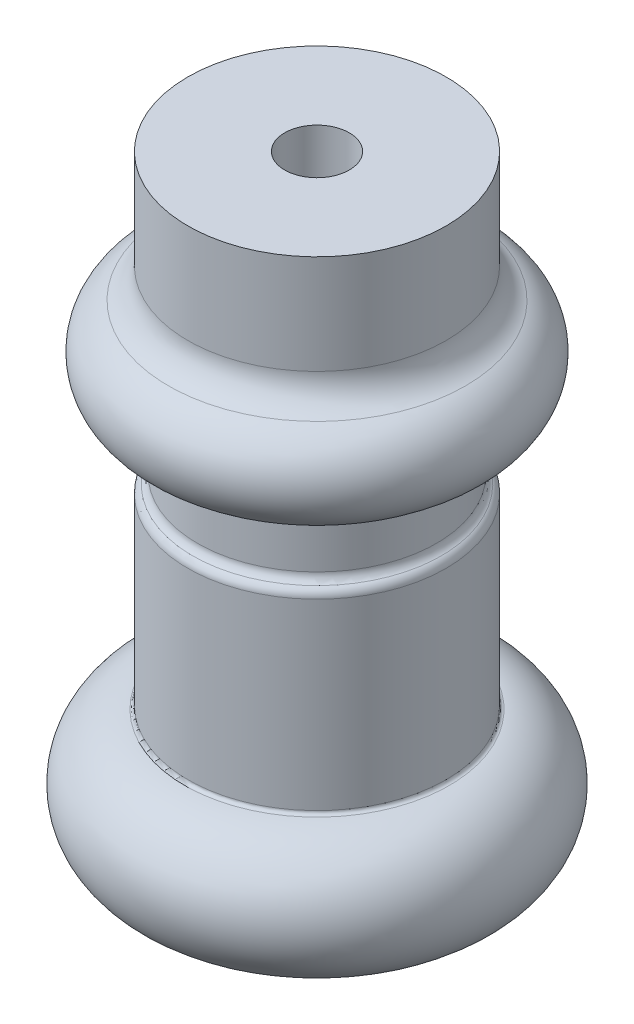
ISO-10303-21;
HEADER;
FILE_DESCRIPTION(('STEP AP214'),'2;1');
FILE_NAME('part.step','',(''),(''),'','','');
FILE_SCHEMA(('AUTOMOTIVE_DESIGN { 1 0 10303 214 1 1 1 1 }'));
ENDSEC;
DATA;
#1=APPLICATION_CONTEXT('core data for automotive mechanical design processes');
#2=APPLICATION_PROTOCOL_DEFINITION('international standard','automotive_design',2000,#1);
#3=PRODUCT_CONTEXT('',#1,'mechanical');
#4=PRODUCT('Part','Part','',(#3));
#5=PRODUCT_RELATED_PRODUCT_CATEGORY('part','',(#4));
#6=PRODUCT_DEFINITION_FORMATION('','',#4);
#7=PRODUCT_DEFINITION_CONTEXT('part definition',#1,'design');
#8=PRODUCT_DEFINITION('design','',#6,#7);
#9=PRODUCT_DEFINITION_SHAPE('','',#8);
#10=(LENGTH_UNIT() NAMED_UNIT(*) SI_UNIT(.MILLI.,.METRE.));
#11=(NAMED_UNIT(*) PLANE_ANGLE_UNIT() SI_UNIT($,.RADIAN.));
#12=(NAMED_UNIT(*) SI_UNIT($,.STERADIAN.) SOLID_ANGLE_UNIT());
#13=UNCERTAINTY_MEASURE_WITH_UNIT(LENGTH_MEASURE(1.E-05),#10,'distance_accuracy_value','');
#14=(GEOMETRIC_REPRESENTATION_CONTEXT(3) GLOBAL_UNCERTAINTY_ASSIGNED_CONTEXT((#13)) GLOBAL_UNIT_ASSIGNED_CONTEXT((#10,
#11,#12)) REPRESENTATION_CONTEXT('',''));
#15=CARTESIAN_POINT('',(0.,0.,0.));
#16=DIRECTION('',(0.,0.,1.));
#17=DIRECTION('',(1.,0.,0.));
#18=AXIS2_PLACEMENT_3D('',#15,#16,#17);
#19=CARTESIAN_POINT('',(-12.047292046932,66.4662497286088,0.));
#20=DIRECTION('',(0.,1.,0.));
#21=DIRECTION('',(-1.,0.,0.));
#22=AXIS2_PLACEMENT_3D('',#19,#20,#21);
#23=TOROIDAL_SURFACE('',#22,50.,10.);
#24=CARTESIAN_POINT('',(-12.047292046932,66.4662497286088,0.));
#25=DIRECTION('',(0.,1.,0.));
#26=DIRECTION('',(-1.,0.,0.));
#27=AXIS2_PLACEMENT_3D('',#24,#25,#26);
#28=CIRCLE('',#27,40.);
#29=CARTESIAN_POINT('',(-52.047292046932,66.4662497286088,0.));
#30=VERTEX_POINT('',#29);
#31=EDGE_CURVE('E10',#30,#30,#28,.T.);
#32=ORIENTED_EDGE('',*,*,#31,.F.);
#33=EDGE_LOOP('',(#32));
#34=FACE_BOUND('',#33,.T.);
#35=CARTESIAN_POINT('',(-12.047292046932,57.3010983386971,0.));
#36=DIRECTION('',(0.,1.,0.));
#37=DIRECTION('',(-1.,0.,0.));
#38=AXIS2_PLACEMENT_3D('',#35,#36,#37);
#39=CIRCLE('',#38,46.);
#40=CARTESIAN_POINT('',(-58.047292046932,57.3010983386971,0.));
#41=VERTEX_POINT('',#40);
#42=EDGE_CURVE('E95',#41,#41,#39,.T.);
#43=ORIENTED_EDGE('',*,*,#42,.T.);
#44=EDGE_LOOP('',(#43));
#45=FACE_BOUND('',#44,.T.);
#46=ADVANCED_FACE('F40',(#34,#45),#23,.F.);
#47=CARTESIAN_POINT('',(-12.047292046932,-59.0452330936272,0.));
#48=DIRECTION('',(0.,1.,0.));
#49=DIRECTION('',(-1.,0.,0.));
#50=AXIS2_PLACEMENT_3D('',#47,#48,#49);
#51=CYLINDRICAL_SURFACE('',#50,40.);
#52=CARTESIAN_POINT('',(-12.047292046932,97.211500143964,0.));
#53=DIRECTION('',(0.,1.,0.));
#54=DIRECTION('',(-1.,0.,0.));
#55=AXIS2_PLACEMENT_3D('',#52,#53,#54);
#56=CIRCLE('',#55,40.);
#57=CARTESIAN_POINT('',(-52.047292046932,97.211500143964,0.));
#58=VERTEX_POINT('',#57);
#59=EDGE_CURVE('E47',#58,#58,#56,.T.);
#60=ORIENTED_EDGE('',*,*,#59,.F.);
#61=EDGE_LOOP('',(#60));
#62=FACE_BOUND('',#61,.T.);
#63=ORIENTED_EDGE('',*,*,#31,.T.);
#64=EDGE_LOOP('',(#63));
#65=FACE_BOUND('',#64,.T.);
#66=ADVANCED_FACE('F160',(#62,#65),#51,.T.);
#67=CARTESIAN_POINT('',(-2.04729204693199,97.211500143964,0.));
#68=DIRECTION('',(0.,-1.,0.));
#69=DIRECTION('',(1.,0.,0.));
#70=AXIS2_PLACEMENT_3D('',#67,#68,#69);
#71=PLANE('',#70);
#72=CARTESIAN_POINT('',(-12.047292046932,97.211500143964,0.));
#73=DIRECTION('',(0.,1.,0.));
#74=DIRECTION('',(-1.,0.,0.));
#75=AXIS2_PLACEMENT_3D('',#72,#73,#74);
#76=CIRCLE('',#75,9.99999999999999);
#77=CARTESIAN_POINT('',(-22.047292046932,97.211500143964,0.));
#78=VERTEX_POINT('',#77);
#79=EDGE_CURVE('E52',#78,#78,#76,.T.);
#80=ORIENTED_EDGE('',*,*,#79,.F.);
#81=EDGE_LOOP('',(#80));
#82=FACE_BOUND('',#81,.T.);
#83=ORIENTED_EDGE('',*,*,#59,.T.);
#84=EDGE_LOOP('',(#83));
#85=FACE_BOUND('',#84,.T.);
#86=ADVANCED_FACE('F165',(#82,#85),#71,.F.);
#87=CARTESIAN_POINT('',(-12.047292046932,-59.0452330936272,0.));
#88=DIRECTION('',(0.,1.,0.));
#89=DIRECTION('',(-1.,0.,0.));
#90=AXIS2_PLACEMENT_3D('',#87,#88,#89);
#91=CYLINDRICAL_SURFACE('',#90,9.99999999999999);
#92=CARTESIAN_POINT('',(-12.047292046932,34.3439740420331,0.));
#93=DIRECTION('',(0.,1.,0.));
#94=DIRECTION('',(-1.,0.,0.));
#95=AXIS2_PLACEMENT_3D('',#92,#93,#94);
#96=CIRCLE('',#95,9.99999999999999);
#97=CARTESIAN_POINT('',(-22.047292046932,34.3439740420331,0.));
#98=VERTEX_POINT('',#97);
#99=EDGE_CURVE('E57',#98,#98,#96,.T.);
#100=ORIENTED_EDGE('',*,*,#99,.F.);
#101=EDGE_LOOP('',(#100));
#102=FACE_BOUND('',#101,.T.);
#103=ORIENTED_EDGE('',*,*,#79,.T.);
#104=EDGE_LOOP('',(#103));
#105=FACE_BOUND('',#104,.T.);
#106=ADVANCED_FACE('F156',(#102,#105),#91,.F.);
#107=CARTESIAN_POINT('',(-12.047292046932,34.3439740420331,0.));
#108=DIRECTION('',(0.,-1.,0.));
#109=DIRECTION('',(1.,0.,0.));
#110=AXIS2_PLACEMENT_3D('',#107,#108,#109);
#111=PLANE('',#110);
#112=ORIENTED_EDGE('',*,*,#99,.T.);
#113=EDGE_LOOP('',(#112));
#114=FACE_BOUND('',#113,.T.);
#115=ADVANCED_FACE('F151',(#114),#111,.F.);
#116=CARTESIAN_POINT('',(-12.047292046932,-90.6560259579669,0.));
#117=DIRECTION('',(0.,1.,0.));
#118=DIRECTION('',(-1.,0.,0.));
#119=AXIS2_PLACEMENT_3D('',#116,#117,#118);
#120=PLANE('',#119);
#121=CARTESIAN_POINT('',(-12.047292046932,-90.6560259579669,0.));
#122=DIRECTION('',(0.,1.,0.));
#123=DIRECTION('',(-1.,0.,0.));
#124=AXIS2_PLACEMENT_3D('',#121,#122,#123);
#125=CIRCLE('',#124,47.1876513233572);
#126=CARTESIAN_POINT('',(-59.2349433702891,-90.6560259579669,0.));
#127=VERTEX_POINT('',#126);
#128=EDGE_CURVE('E63',#127,#127,#125,.T.);
#129=ORIENTED_EDGE('',*,*,#128,.F.);
#130=EDGE_LOOP('',(#129));
#131=FACE_BOUND('',#130,.T.);
#132=ADVANCED_FACE('F146',(#131),#120,.F.);
#133=CARTESIAN_POINT('',(-12.047292046932,-72.3253084026108,0.));
#134=DIRECTION('',(0.,1.,0.));
#135=DIRECTION('',(-1.,0.,0.));
#136=AXIS2_PLACEMENT_3D('',#133,#134,#135);
#137=TOROIDAL_SURFACE('',#136,39.1886017607054,20.);
#138=CARTESIAN_POINT('',(-12.047292046932,-52.4053806017237,0.));
#139=DIRECTION('',(0.,1.,0.));
#140=DIRECTION('',(-1.,0.,0.));
#141=AXIS2_PLACEMENT_3D('',#138,#139,#140);
#142=CIRCLE('',#141,40.9764709973792);
#143=CARTESIAN_POINT('',(-53.0237630443112,-52.4053806017237,0.));
#144=VERTEX_POINT('',#143);
#145=EDGE_CURVE('E67',#144,#144,#142,.T.);
#146=ORIENTED_EDGE('',*,*,#145,.F.);
#147=EDGE_LOOP('',(#146));
#148=FACE_BOUND('',#147,.T.);
#149=ORIENTED_EDGE('',*,*,#128,.T.);
#150=EDGE_LOOP('',(#149));
#151=FACE_BOUND('',#150,.T.);
#152=ADVANCED_FACE('F140',(#148,#151),#137,.T.);
#153=CARTESIAN_POINT('',(-12.047292046932,-51.3373434774447,0.));
#154=DIRECTION('',(0.,1.,0.));
#155=DIRECTION('',(-1.,0.,0.));
#156=AXIS2_PLACEMENT_3D('',#153,#154,#155);
#157=TOROIDAL_SURFACE('',#156,41.0723303166102,1.07233031661027);
#158=CARTESIAN_POINT('',(-12.047292046932,-51.3373434774447,0.));
#159=DIRECTION('',(0.,1.,0.));
#160=DIRECTION('',(-1.,0.,0.));
#161=AXIS2_PLACEMENT_3D('',#158,#159,#160);
#162=CIRCLE('',#161,40.);
#163=CARTESIAN_POINT('',(-52.0472920469319,-51.3373434774447,0.));
#164=VERTEX_POINT('',#163);
#165=EDGE_CURVE('E71',#164,#164,#162,.T.);
#166=ORIENTED_EDGE('',*,*,#165,.F.);
#167=EDGE_LOOP('',(#166));
#168=FACE_BOUND('',#167,.T.);
#169=ORIENTED_EDGE('',*,*,#145,.T.);
#170=EDGE_LOOP('',(#169));
#171=FACE_BOUND('',#170,.T.);
#172=ADVANCED_FACE('F134',(#168,#171),#157,.F.);
#173=CARTESIAN_POINT('',(-12.047292046932,-59.0452330936272,0.));
#174=DIRECTION('',(0.,1.,0.));
#175=DIRECTION('',(-1.,0.,0.));
#176=AXIS2_PLACEMENT_3D('',#173,#174,#175);
#177=CYLINDRICAL_SURFACE('',#176,40.);
#178=CARTESIAN_POINT('',(-12.047292046932,5.35721883112297,0.));
#179=DIRECTION('',(0.,1.,0.));
#180=DIRECTION('',(-1.,0.,0.));
#181=AXIS2_PLACEMENT_3D('',#178,#179,#180);
#182=CIRCLE('',#181,40.);
#183=CARTESIAN_POINT('',(-52.047292046932,5.35721883112296,0.));
#184=VERTEX_POINT('',#183);
#185=EDGE_CURVE('E75',#184,#184,#182,.T.);
#186=ORIENTED_EDGE('',*,*,#185,.F.);
#187=EDGE_LOOP('',(#186));
#188=FACE_BOUND('',#187,.T.);
#189=ORIENTED_EDGE('',*,*,#165,.T.);
#190=EDGE_LOOP('',(#189));
#191=FACE_BOUND('',#190,.T.);
#192=ADVANCED_FACE('F128',(#188,#191),#177,.T.);
#193=CARTESIAN_POINT('',(-12.047292046932,5.35721883112297,0.));
#194=DIRECTION('',(0.,1.,0.));
#195=DIRECTION('',(-1.,0.,0.));
#196=AXIS2_PLACEMENT_3D('',#193,#194,#195);
#197=TOROIDAL_SURFACE('',#196,37.,3.);
#198=CARTESIAN_POINT('',(-12.047292046932,7.95529504247628,0.));
#199=DIRECTION('',(0.,1.,0.));
#200=DIRECTION('',(-1.,0.,0.));
#201=AXIS2_PLACEMENT_3D('',#198,#199,#200);
#202=CIRCLE('',#201,38.5);
#203=CARTESIAN_POINT('',(-50.547292046932,7.95529504247628,0.));
#204=VERTEX_POINT('',#203);
#205=EDGE_CURVE('E79',#204,#204,#202,.T.);
#206=ORIENTED_EDGE('',*,*,#205,.F.);
#207=EDGE_LOOP('',(#206));
#208=FACE_BOUND('',#207,.T.);
#209=ORIENTED_EDGE('',*,*,#185,.T.);
#210=EDGE_LOOP('',(#209));
#211=FACE_BOUND('',#210,.T.);
#212=ADVANCED_FACE('F122',(#208,#211),#197,.T.);
#213=CARTESIAN_POINT('',(-12.047292046932,10.5533712538296,0.));
#214=DIRECTION('',(0.,1.,0.));
#215=DIRECTION('',(-1.,0.,0.));
#216=AXIS2_PLACEMENT_3D('',#213,#214,#215);
#217=TOROIDAL_SURFACE('',#216,40.,3.);
#218=CARTESIAN_POINT('',(-12.047292046932,10.5533712538296,0.));
#219=DIRECTION('',(0.,1.,0.));
#220=DIRECTION('',(-1.,0.,0.));
#221=AXIS2_PLACEMENT_3D('',#218,#219,#220);
#222=CIRCLE('',#221,37.);
#223=CARTESIAN_POINT('',(-49.047292046932,10.5533712538296,0.));
#224=VERTEX_POINT('',#223);
#225=EDGE_CURVE('E83',#224,#224,#222,.T.);
#226=ORIENTED_EDGE('',*,*,#225,.F.);
#227=EDGE_LOOP('',(#226));
#228=FACE_BOUND('',#227,.T.);
#229=ORIENTED_EDGE('',*,*,#205,.T.);
#230=EDGE_LOOP('',(#229));
#231=FACE_BOUND('',#230,.T.);
#232=ADVANCED_FACE('F116',(#228,#231),#217,.F.);
#233=CARTESIAN_POINT('',(-12.047292046932,-59.0452330936272,0.));
#234=DIRECTION('',(0.,1.,0.));
#235=DIRECTION('',(-1.,0.,0.));
#236=AXIS2_PLACEMENT_3D('',#233,#234,#235);
#237=CYLINDRICAL_SURFACE('',#236,37.);
#238=CARTESIAN_POINT('',(-12.047292046932,25.5533712538296,0.));
#239=DIRECTION('',(0.,1.,0.));
#240=DIRECTION('',(-1.,0.,0.));
#241=AXIS2_PLACEMENT_3D('',#238,#239,#240);
#242=CIRCLE('',#241,37.);
#243=CARTESIAN_POINT('',(-49.047292046932,25.5533712538296,0.));
#244=VERTEX_POINT('',#243);
#245=EDGE_CURVE('E87',#244,#244,#242,.T.);
#246=ORIENTED_EDGE('',*,*,#245,.F.);
#247=EDGE_LOOP('',(#246));
#248=FACE_BOUND('',#247,.T.);
#249=ORIENTED_EDGE('',*,*,#225,.T.);
#250=EDGE_LOOP('',(#249));
#251=FACE_BOUND('',#250,.T.);
#252=ADVANCED_FACE('F110',(#248,#251),#237,.T.);
#253=CARTESIAN_POINT('',(-12.047292046932,25.5533712538296,0.));
#254=DIRECTION('',(0.,1.,0.));
#255=DIRECTION('',(-1.,0.,0.));
#256=AXIS2_PLACEMENT_3D('',#253,#254,#255);
#257=TOROIDAL_SURFACE('',#256,40.,3.);
#258=CARTESIAN_POINT('',(-12.047292046932,28.5533712538296,0.));
#259=DIRECTION('',(0.,1.,0.));
#260=DIRECTION('',(-1.,0.,0.));
#261=AXIS2_PLACEMENT_3D('',#258,#259,#260);
#262=CIRCLE('',#261,40.);
#263=CARTESIAN_POINT('',(-52.047292046932,28.5533712538296,0.));
#264=VERTEX_POINT('',#263);
#265=EDGE_CURVE('E91',#264,#264,#262,.T.);
#266=ORIENTED_EDGE('',*,*,#265,.F.);
#267=EDGE_LOOP('',(#266));
#268=FACE_BOUND('',#267,.T.);
#269=ORIENTED_EDGE('',*,*,#245,.T.);
#270=EDGE_LOOP('',(#269));
#271=FACE_BOUND('',#270,.T.);
#272=ADVANCED_FACE('F104',(#268,#271),#257,.F.);
#273=CARTESIAN_POINT('',(-12.047292046932,43.5533712538296,0.));
#274=DIRECTION('',(0.,1.,0.));
#275=DIRECTION('',(-1.,0.,0.));
#276=AXIS2_PLACEMENT_3D('',#273,#274,#275);
#277=TOROIDAL_SURFACE('',#276,40.,15.);
#278=ORIENTED_EDGE('',*,*,#42,.F.);
#279=EDGE_LOOP('',(#278));
#280=FACE_BOUND('',#279,.T.);
#281=ORIENTED_EDGE('',*,*,#265,.T.);
#282=EDGE_LOOP('',(#281));
#283=FACE_BOUND('',#282,.T.);
#284=ADVANCED_FACE('F101',(#280,#283),#277,.T.);
#285=CLOSED_SHELL('',(#46,#66,#86,#106,#115,#132,#152,#172,#192,#212,#232,#252,#272,#284));
#286=MANIFOLD_SOLID_BREP('B2',#285);
#287=ADVANCED_BREP_SHAPE_REPRESENTATION('',(#18,#286),#14);
#288=SHAPE_DEFINITION_REPRESENTATION(#9,#287);
ENDSEC;
END-ISO-10303-21;
